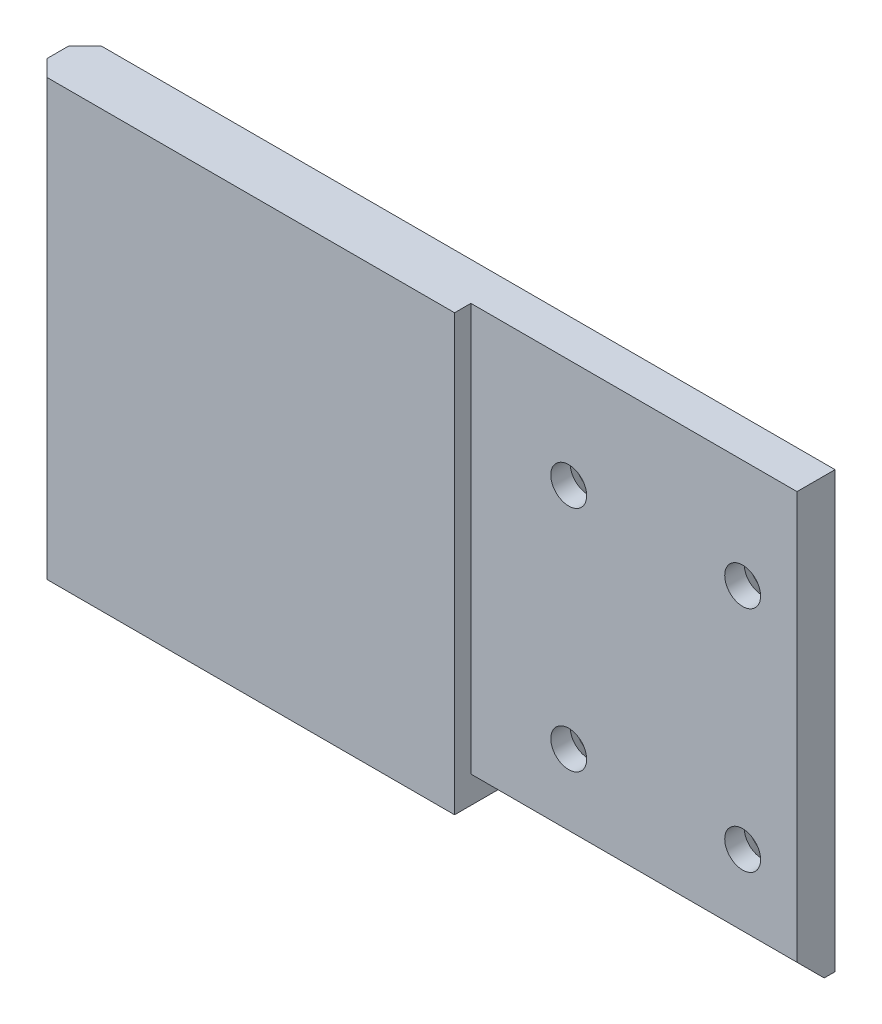
ISO-10303-21;
HEADER;
FILE_DESCRIPTION(('STEP AP214'),'2;1');
FILE_NAME('part.step','',(''),(''),'','','');
FILE_SCHEMA(('AUTOMOTIVE_DESIGN { 1 0 10303 214 1 1 1 1 }'));
ENDSEC;
DATA;
#1=APPLICATION_CONTEXT('core data for automotive mechanical design processes');
#2=APPLICATION_PROTOCOL_DEFINITION('international standard','automotive_design',2000,#1);
#3=PRODUCT_CONTEXT('',#1,'mechanical');
#4=PRODUCT('Part','Part','',(#3));
#5=PRODUCT_RELATED_PRODUCT_CATEGORY('part','',(#4));
#6=PRODUCT_DEFINITION_FORMATION('','',#4);
#7=PRODUCT_DEFINITION_CONTEXT('part definition',#1,'design');
#8=PRODUCT_DEFINITION('design','',#6,#7);
#9=PRODUCT_DEFINITION_SHAPE('','',#8);
#10=(LENGTH_UNIT() NAMED_UNIT(*) SI_UNIT(.MILLI.,.METRE.));
#11=(NAMED_UNIT(*) PLANE_ANGLE_UNIT() SI_UNIT($,.RADIAN.));
#12=(NAMED_UNIT(*) SI_UNIT($,.STERADIAN.) SOLID_ANGLE_UNIT());
#13=UNCERTAINTY_MEASURE_WITH_UNIT(LENGTH_MEASURE(1.E-05),#10,'distance_accuracy_value','');
#14=(GEOMETRIC_REPRESENTATION_CONTEXT(3) GLOBAL_UNCERTAINTY_ASSIGNED_CONTEXT((#13)) GLOBAL_UNIT_ASSIGNED_CONTEXT((#10,
#11,#12)) REPRESENTATION_CONTEXT('',''));
#15=CARTESIAN_POINT('',(0.,0.,0.));
#16=DIRECTION('',(0.,0.,1.));
#17=DIRECTION('',(1.,0.,0.));
#18=AXIS2_PLACEMENT_3D('',#15,#16,#17);
#19=CARTESIAN_POINT('',(0.,0.,10.));
#20=DIRECTION('',(-1.,0.,0.));
#21=DIRECTION('',(0.,0.,1.));
#22=AXIS2_PLACEMENT_3D('',#19,#20,#21);
#23=PLANE('',#22);
#24=DIRECTION('',(0.,1.,0.));
#25=VECTOR('',#24,1.);
#26=CARTESIAN_POINT('',(0.,0.,7.));
#27=LINE('',#26,#25);
#28=CARTESIAN_POINT('',(0.,4.99999999999999,7.));
#29=VERTEX_POINT('',#28);
#30=CARTESIAN_POINT('',(0.,80.,7.));
#31=VERTEX_POINT('',#30);
#32=EDGE_CURVE('E116',#29,#31,#27,.T.);
#33=ORIENTED_EDGE('',*,*,#32,.F.);
#34=DIRECTION('',(0.,-0.707106781186547,-0.707106781186548));
#35=VECTOR('',#34,1.);
#36=CARTESIAN_POINT('',(0.,4.99999999999999,7.));
#37=LINE('',#36,#35);
#38=CARTESIAN_POINT('',(0.,0.,2.));
#39=VERTEX_POINT('',#38);
#40=EDGE_CURVE('E144',#29,#39,#37,.T.);
#41=ORIENTED_EDGE('',*,*,#40,.T.);
#42=DIRECTION('',(0.,0.,-1.));
#43=VECTOR('',#42,1.);
#44=CARTESIAN_POINT('',(0.,0.,10.));
#45=LINE('',#44,#43);
#46=CARTESIAN_POINT('',(0.,0.,0.));
#47=VERTEX_POINT('',#46);
#48=EDGE_CURVE('E225',#39,#47,#45,.T.);
#49=ORIENTED_EDGE('',*,*,#48,.T.);
#50=DIRECTION('',(0.,1.,0.));
#51=VECTOR('',#50,1.);
#52=CARTESIAN_POINT('',(0.,0.,0.));
#53=LINE('',#52,#51);
#54=CARTESIAN_POINT('',(0.,80.,0.));
#55=VERTEX_POINT('',#54);
#56=EDGE_CURVE('E138',#47,#55,#53,.T.);
#57=ORIENTED_EDGE('',*,*,#56,.T.);
#58=DIRECTION('',(0.,0.,-1.));
#59=VECTOR('',#58,1.);
#60=CARTESIAN_POINT('',(0.,80.,10.));
#61=LINE('',#60,#59);
#62=EDGE_CURVE('E130',#31,#55,#61,.T.);
#63=ORIENTED_EDGE('',*,*,#62,.F.);
#64=EDGE_LOOP('',(#33,#41,#49,#57,#63));
#65=FACE_BOUND('',#64,.T.);
#66=ADVANCED_FACE('F39',(#65),#23,.F.);
#67=CARTESIAN_POINT('',(0.,80.,10.));
#68=DIRECTION('',(0.,-1.,0.));
#69=DIRECTION('',(1.,0.,0.));
#70=AXIS2_PLACEMENT_3D('',#67,#68,#69);
#71=PLANE('',#70);
#72=DIRECTION('',(-1.,0.,0.));
#73=VECTOR('',#72,1.);
#74=CARTESIAN_POINT('',(0.,80.,0.));
#75=LINE('',#74,#73);
#76=CARTESIAN_POINT('',(-135.,80.,0.));
#77=VERTEX_POINT('',#76);
#78=EDGE_CURVE('E201',#55,#77,#75,.T.);
#79=ORIENTED_EDGE('',*,*,#78,.T.);
#80=DIRECTION('',(0.707106781186548,0.,-0.707106781186548));
#81=VECTOR('',#80,1.);
#82=CARTESIAN_POINT('',(-138.,80.,3.00000000000001));
#83=LINE('',#82,#81);
#84=CARTESIAN_POINT('',(-138.,80.,3.));
#85=VERTEX_POINT('',#84);
#86=EDGE_CURVE('E48',#77,#85,#83,.F.);
#87=ORIENTED_EDGE('',*,*,#86,.T.);
#88=DIRECTION('',(0.,0.,-1.));
#89=VECTOR('',#88,1.);
#90=CARTESIAN_POINT('',(-138.,80.,10.));
#91=LINE('',#90,#89);
#92=CARTESIAN_POINT('',(-138.,80.,7.00000000000001));
#93=VERTEX_POINT('',#92);
#94=EDGE_CURVE('E140',#93,#85,#91,.T.);
#95=ORIENTED_EDGE('',*,*,#94,.F.);
#96=DIRECTION('',(0.707106781186549,0.,0.707106781186546));
#97=VECTOR('',#96,1.);
#98=CARTESIAN_POINT('',(-135.,80.,10.));
#99=LINE('',#98,#97);
#100=CARTESIAN_POINT('',(-135.,80.,10.));
#101=VERTEX_POINT('',#100);
#102=EDGE_CURVE('E55',#93,#101,#99,.T.);
#103=ORIENTED_EDGE('',*,*,#102,.T.);
#104=DIRECTION('',(-1.,0.,0.));
#105=VECTOR('',#104,1.);
#106=CARTESIAN_POINT('',(0.,80.,10.));
#107=LINE('',#106,#105);
#108=CARTESIAN_POINT('',(-60.,80.,10.));
#109=VERTEX_POINT('',#108);
#110=EDGE_CURVE('E216',#109,#101,#107,.T.);
#111=ORIENTED_EDGE('',*,*,#110,.F.);
#112=DIRECTION('',(0.,0.,1.));
#113=VECTOR('',#112,1.);
#114=CARTESIAN_POINT('',(-60.,80.,7.));
#115=LINE('',#114,#113);
#116=CARTESIAN_POINT('',(-60.,80.,7.));
#117=VERTEX_POINT('',#116);
#118=EDGE_CURVE('E131',#117,#109,#115,.T.);
#119=ORIENTED_EDGE('',*,*,#118,.F.);
#120=DIRECTION('',(-1.,0.,0.));
#121=VECTOR('',#120,1.);
#122=CARTESIAN_POINT('',(0.,80.,7.));
#123=LINE('',#122,#121);
#124=EDGE_CURVE('E120',#31,#117,#123,.T.);
#125=ORIENTED_EDGE('',*,*,#124,.F.);
#126=ORIENTED_EDGE('',*,*,#62,.T.);
#127=EDGE_LOOP('',(#79,#87,#95,#103,#111,#119,#125,#126));
#128=FACE_BOUND('',#127,.T.);
#129=ADVANCED_FACE('F129',(#128),#71,.F.);
#130=CARTESIAN_POINT('',(-138.,0.,10.));
#131=DIRECTION('',(1.,0.,0.));
#132=DIRECTION('',(0.,0.,-1.));
#133=AXIS2_PLACEMENT_3D('',#130,#131,#132);
#134=PLANE('',#133);
#135=ORIENTED_EDGE('',*,*,#94,.T.);
#136=DIRECTION('',(0.,-1.,0.));
#137=VECTOR('',#136,1.);
#138=CARTESIAN_POINT('',(-138.,0.,3.));
#139=LINE('',#138,#137);
#140=CARTESIAN_POINT('',(-138.,0.,3.));
#141=VERTEX_POINT('',#140);
#142=EDGE_CURVE('E186',#85,#141,#139,.T.);
#143=ORIENTED_EDGE('',*,*,#142,.T.);
#144=DIRECTION('',(0.,0.,-1.));
#145=VECTOR('',#144,1.);
#146=CARTESIAN_POINT('',(-138.,0.,10.));
#147=LINE('',#146,#145);
#148=CARTESIAN_POINT('',(-138.,0.,7.00000000000001));
#149=VERTEX_POINT('',#148);
#150=EDGE_CURVE('E147',#149,#141,#147,.T.);
#151=ORIENTED_EDGE('',*,*,#150,.F.);
#152=DIRECTION('',(0.,1.,0.));
#153=VECTOR('',#152,1.);
#154=CARTESIAN_POINT('',(-138.,80.,7.00000000000001));
#155=LINE('',#154,#153);
#156=EDGE_CURVE('E183',#149,#93,#155,.T.);
#157=ORIENTED_EDGE('',*,*,#156,.T.);
#158=EDGE_LOOP('',(#135,#143,#151,#157));
#159=FACE_BOUND('',#158,.T.);
#160=ADVANCED_FACE('F205',(#159),#134,.F.);
#161=CARTESIAN_POINT('',(0.,0.,10.));
#162=DIRECTION('',(0.,1.,0.));
#163=DIRECTION('',(0.,0.,1.));
#164=AXIS2_PLACEMENT_3D('',#161,#162,#163);
#165=PLANE('',#164);
#166=ORIENTED_EDGE('',*,*,#150,.T.);
#167=DIRECTION('',(-0.707106781186548,0.,0.707106781186548));
#168=VECTOR('',#167,1.);
#169=CARTESIAN_POINT('',(-138.,0.,3.));
#170=LINE('',#169,#168);
#171=CARTESIAN_POINT('',(-135.,0.,0.));
#172=VERTEX_POINT('',#171);
#173=EDGE_CURVE('E193',#141,#172,#170,.F.);
#174=ORIENTED_EDGE('',*,*,#173,.T.);
#175=DIRECTION('',(1.,0.,0.));
#176=VECTOR('',#175,1.);
#177=CARTESIAN_POINT('',(0.,0.,0.));
#178=LINE('',#177,#176);
#179=EDGE_CURVE('E213',#172,#47,#178,.T.);
#180=ORIENTED_EDGE('',*,*,#179,.T.);
#181=ORIENTED_EDGE('',*,*,#48,.F.);
#182=DIRECTION('',(-1.,0.,0.));
#183=VECTOR('',#182,1.);
#184=CARTESIAN_POINT('',(-60.,0.,2.));
#185=LINE('',#184,#183);
#186=CARTESIAN_POINT('',(-60.,0.,2.));
#187=VERTEX_POINT('',#186);
#188=EDGE_CURVE('E176',#39,#187,#185,.T.);
#189=ORIENTED_EDGE('',*,*,#188,.T.);
#190=DIRECTION('',(0.,0.,1.));
#191=VECTOR('',#190,1.);
#192=CARTESIAN_POINT('',(-60.,0.,7.));
#193=LINE('',#192,#191);
#194=CARTESIAN_POINT('',(-60.,0.,10.));
#195=VERTEX_POINT('',#194);
#196=EDGE_CURVE('E236',#187,#195,#193,.T.);
#197=ORIENTED_EDGE('',*,*,#196,.T.);
#198=DIRECTION('',(1.,0.,0.));
#199=VECTOR('',#198,1.);
#200=CARTESIAN_POINT('',(0.,0.,10.));
#201=LINE('',#200,#199);
#202=CARTESIAN_POINT('',(-135.,0.,10.));
#203=VERTEX_POINT('',#202);
#204=EDGE_CURVE('E220',#203,#195,#201,.T.);
#205=ORIENTED_EDGE('',*,*,#204,.F.);
#206=DIRECTION('',(-0.707106781186549,0.,-0.707106781186546));
#207=VECTOR('',#206,1.);
#208=CARTESIAN_POINT('',(-135.,0.,10.));
#209=LINE('',#208,#207);
#210=EDGE_CURVE('E190',#203,#149,#209,.T.);
#211=ORIENTED_EDGE('',*,*,#210,.T.);
#212=EDGE_LOOP('',(#166,#174,#180,#181,#189,#197,#205,#211));
#213=FACE_BOUND('',#212,.T.);
#214=ADVANCED_FACE('F211',(#213),#165,.F.);
#215=CARTESIAN_POINT('',(0.,0.,10.));
#216=DIRECTION('',(0.,0.,1.));
#217=DIRECTION('',(1.,0.,0.));
#218=AXIS2_PLACEMENT_3D('',#215,#216,#217);
#219=PLANE('',#218);
#220=ORIENTED_EDGE('',*,*,#110,.T.);
#221=DIRECTION('',(0.,-1.,0.));
#222=VECTOR('',#221,1.);
#223=CARTESIAN_POINT('',(-135.,0.,10.));
#224=LINE('',#223,#222);
#225=EDGE_CURVE('E11',#101,#203,#224,.T.);
#226=ORIENTED_EDGE('',*,*,#225,.T.);
#227=ORIENTED_EDGE('',*,*,#204,.T.);
#228=DIRECTION('',(0.,-1.,0.));
#229=VECTOR('',#228,1.);
#230=CARTESIAN_POINT('',(-60.,0.,10.));
#231=LINE('',#230,#229);
#232=EDGE_CURVE('E127',#109,#195,#231,.T.);
#233=ORIENTED_EDGE('',*,*,#232,.F.);
#234=EDGE_LOOP('',(#220,#226,#227,#233));
#235=FACE_BOUND('',#234,.T.);
#236=ADVANCED_FACE('F277',(#235),#219,.T.);
#237=CARTESIAN_POINT('',(0.,0.,0.));
#238=DIRECTION('',(0.,0.,1.));
#239=DIRECTION('',(1.,0.,0.));
#240=AXIS2_PLACEMENT_3D('',#237,#238,#239);
#241=PLANE('',#240);
#242=CARTESIAN_POINT('',(-9.99999999999999,60.,0.));
#243=DIRECTION('',(0.,0.,-1.));
#244=DIRECTION('',(-1.,0.,0.));
#245=AXIS2_PLACEMENT_3D('',#242,#243,#244);
#246=CIRCLE('',#245,6.72);
#247=CARTESIAN_POINT('',(-16.72,60.,0.));
#248=VERTEX_POINT('',#247);
#249=EDGE_CURVE('E267',#248,#248,#246,.T.);
#250=ORIENTED_EDGE('',*,*,#249,.F.);
#251=EDGE_LOOP('',(#250));
#252=FACE_BOUND('',#251,.T.);
#253=CARTESIAN_POINT('',(-42.,60.,0.));
#254=DIRECTION('',(0.,0.,-1.));
#255=DIRECTION('',(-1.,0.,0.));
#256=AXIS2_PLACEMENT_3D('',#253,#254,#255);
#257=CIRCLE('',#256,6.72);
#258=CARTESIAN_POINT('',(-48.72,60.,0.));
#259=VERTEX_POINT('',#258);
#260=EDGE_CURVE('E171',#259,#259,#257,.T.);
#261=ORIENTED_EDGE('',*,*,#260,.F.);
#262=EDGE_LOOP('',(#261));
#263=FACE_BOUND('',#262,.T.);
#264=CARTESIAN_POINT('',(-42.,18.,0.));
#265=DIRECTION('',(0.,0.,-1.));
#266=DIRECTION('',(-1.,0.,0.));
#267=AXIS2_PLACEMENT_3D('',#264,#265,#266);
#268=CIRCLE('',#267,6.72);
#269=CARTESIAN_POINT('',(-48.72,18.,0.));
#270=VERTEX_POINT('',#269);
#271=EDGE_CURVE('E166',#270,#270,#268,.T.);
#272=ORIENTED_EDGE('',*,*,#271,.F.);
#273=EDGE_LOOP('',(#272));
#274=FACE_BOUND('',#273,.T.);
#275=CARTESIAN_POINT('',(-10.,18.,0.));
#276=DIRECTION('',(0.,0.,-1.));
#277=DIRECTION('',(-1.,0.,0.));
#278=AXIS2_PLACEMENT_3D('',#275,#276,#277);
#279=CIRCLE('',#278,6.72);
#280=CARTESIAN_POINT('',(-16.72,18.,0.));
#281=VERTEX_POINT('',#280);
#282=EDGE_CURVE('E160',#281,#281,#279,.T.);
#283=ORIENTED_EDGE('',*,*,#282,.F.);
#284=EDGE_LOOP('',(#283));
#285=FACE_BOUND('',#284,.T.);
#286=ORIENTED_EDGE('',*,*,#179,.F.);
#287=DIRECTION('',(0.,1.,0.));
#288=VECTOR('',#287,1.);
#289=CARTESIAN_POINT('',(-135.,0.,0.));
#290=LINE('',#289,#288);
#291=EDGE_CURVE('E63',#172,#77,#290,.T.);
#292=ORIENTED_EDGE('',*,*,#291,.T.);
#293=ORIENTED_EDGE('',*,*,#78,.F.);
#294=ORIENTED_EDGE('',*,*,#56,.F.);
#295=EDGE_LOOP('',(#286,#292,#293,#294));
#296=FACE_BOUND('',#295,.T.);
#297=ADVANCED_FACE('F214',(#252,#263,#274,#285,#296),#241,.F.);
#298=CARTESIAN_POINT('',(-60.,0.,7.));
#299=DIRECTION('',(-1.,0.,0.));
#300=DIRECTION('',(0.,0.,1.));
#301=AXIS2_PLACEMENT_3D('',#298,#299,#300);
#302=PLANE('',#301);
#303=ORIENTED_EDGE('',*,*,#232,.T.);
#304=ORIENTED_EDGE('',*,*,#196,.F.);
#305=DIRECTION('',(0.,0.707106781186547,0.707106781186548));
#306=VECTOR('',#305,1.);
#307=CARTESIAN_POINT('',(-60.,2.5,4.5));
#308=LINE('',#307,#306);
#309=CARTESIAN_POINT('',(-60.,4.99999999999999,7.));
#310=VERTEX_POINT('',#309);
#311=EDGE_CURVE('E180',#187,#310,#308,.T.);
#312=ORIENTED_EDGE('',*,*,#311,.T.);
#313=DIRECTION('',(0.,-1.,0.));
#314=VECTOR('',#313,1.);
#315=CARTESIAN_POINT('',(-60.,0.,7.));
#316=LINE('',#315,#314);
#317=EDGE_CURVE('E133',#117,#310,#316,.T.);
#318=ORIENTED_EDGE('',*,*,#317,.F.);
#319=ORIENTED_EDGE('',*,*,#118,.T.);
#320=EDGE_LOOP('',(#303,#304,#312,#318,#319));
#321=FACE_BOUND('',#320,.T.);
#322=ADVANCED_FACE('F276',(#321),#302,.F.);
#323=CARTESIAN_POINT('',(0.,0.,7.));
#324=DIRECTION('',(0.,0.,1.));
#325=DIRECTION('',(1.,0.,0.));
#326=AXIS2_PLACEMENT_3D('',#323,#324,#325);
#327=PLANE('',#326);
#328=CARTESIAN_POINT('',(-9.99999999999999,60.,7.));
#329=DIRECTION('',(0.,0.,1.));
#330=DIRECTION('',(1.,0.,0.));
#331=AXIS2_PLACEMENT_3D('',#328,#329,#330);
#332=CIRCLE('',#331,3.29999999999999);
#333=CARTESIAN_POINT('',(-6.7,60.,7.));
#334=VERTEX_POINT('',#333);
#335=EDGE_CURVE('E168',#334,#334,#332,.T.);
#336=ORIENTED_EDGE('',*,*,#335,.F.);
#337=EDGE_LOOP('',(#336));
#338=FACE_BOUND('',#337,.T.);
#339=CARTESIAN_POINT('',(-42.,60.,7.));
#340=DIRECTION('',(0.,0.,1.));
#341=DIRECTION('',(1.,0.,0.));
#342=AXIS2_PLACEMENT_3D('',#339,#340,#341);
#343=CIRCLE('',#342,3.29999999999999);
#344=CARTESIAN_POINT('',(-38.7,60.,7.));
#345=VERTEX_POINT('',#344);
#346=EDGE_CURVE('E162',#345,#345,#343,.T.);
#347=ORIENTED_EDGE('',*,*,#346,.F.);
#348=EDGE_LOOP('',(#347));
#349=FACE_BOUND('',#348,.T.);
#350=CARTESIAN_POINT('',(-42.,18.,7.));
#351=DIRECTION('',(0.,0.,1.));
#352=DIRECTION('',(1.,0.,0.));
#353=AXIS2_PLACEMENT_3D('',#350,#351,#352);
#354=CIRCLE('',#353,3.29999999999999);
#355=CARTESIAN_POINT('',(-38.7,18.,7.));
#356=VERTEX_POINT('',#355);
#357=EDGE_CURVE('E156',#356,#356,#354,.T.);
#358=ORIENTED_EDGE('',*,*,#357,.F.);
#359=EDGE_LOOP('',(#358));
#360=FACE_BOUND('',#359,.T.);
#361=CARTESIAN_POINT('',(-10.,18.,7.));
#362=DIRECTION('',(0.,0.,1.));
#363=DIRECTION('',(1.,0.,0.));
#364=AXIS2_PLACEMENT_3D('',#361,#362,#363);
#365=CIRCLE('',#364,3.29999999999999);
#366=CARTESIAN_POINT('',(-6.70000000000001,18.,7.));
#367=VERTEX_POINT('',#366);
#368=EDGE_CURVE('E151',#367,#367,#365,.T.);
#369=ORIENTED_EDGE('',*,*,#368,.F.);
#370=EDGE_LOOP('',(#369));
#371=FACE_BOUND('',#370,.T.);
#372=ORIENTED_EDGE('',*,*,#317,.T.);
#373=DIRECTION('',(1.,0.,0.));
#374=VECTOR('',#373,1.);
#375=CARTESIAN_POINT('',(0.,4.99999999999999,7.));
#376=LINE('',#375,#374);
#377=EDGE_CURVE('E123',#310,#29,#376,.T.);
#378=ORIENTED_EDGE('',*,*,#377,.T.);
#379=ORIENTED_EDGE('',*,*,#32,.T.);
#380=ORIENTED_EDGE('',*,*,#124,.T.);
#381=EDGE_LOOP('',(#372,#378,#379,#380));
#382=FACE_BOUND('',#381,.T.);
#383=ADVANCED_FACE('F119',(#338,#349,#360,#371,#382),#327,.T.);
#384=CARTESIAN_POINT('',(-10.,18.,0.));
#385=DIRECTION('',(0.,0.,-1.));
#386=DIRECTION('',(-1.,0.,0.));
#387=AXIS2_PLACEMENT_3D('',#384,#385,#386);
#388=CYLINDRICAL_SURFACE('',#387,3.29999999999999);
#389=ORIENTED_EDGE('',*,*,#368,.T.);
#390=EDGE_LOOP('',(#389));
#391=FACE_BOUND('',#390,.T.);
#392=CARTESIAN_POINT('',(-10.,18.,3.42000000000002));
#393=DIRECTION('',(0.,0.,-1.));
#394=DIRECTION('',(-1.,0.,0.));
#395=AXIS2_PLACEMENT_3D('',#392,#393,#394);
#396=CIRCLE('',#395,3.29999999999999);
#397=CARTESIAN_POINT('',(-13.3,18.,3.42000000000002));
#398=VERTEX_POINT('',#397);
#399=EDGE_CURVE('E155',#398,#398,#396,.T.);
#400=ORIENTED_EDGE('',*,*,#399,.T.);
#401=EDGE_LOOP('',(#400));
#402=FACE_BOUND('',#401,.T.);
#403=ADVANCED_FACE('F288',(#391,#402),#388,.F.);
#404=CARTESIAN_POINT('',(-10.,18.,0.));
#405=DIRECTION('',(0.,0.,-1.));
#406=DIRECTION('',(-1.,0.,0.));
#407=AXIS2_PLACEMENT_3D('',#404,#405,#406);
#408=CONICAL_SURFACE('',#407,6.72,0.785398163397447);
#409=ORIENTED_EDGE('',*,*,#399,.F.);
#410=EDGE_LOOP('',(#409));
#411=FACE_BOUND('',#410,.T.);
#412=ORIENTED_EDGE('',*,*,#282,.T.);
#413=EDGE_LOOP('',(#412));
#414=FACE_BOUND('',#413,.T.);
#415=ADVANCED_FACE('F285',(#411,#414),#408,.F.);
#416=CARTESIAN_POINT('',(-42.,18.,0.));
#417=DIRECTION('',(0.,0.,-1.));
#418=DIRECTION('',(-1.,0.,0.));
#419=AXIS2_PLACEMENT_3D('',#416,#417,#418);
#420=CYLINDRICAL_SURFACE('',#419,3.29999999999999);
#421=ORIENTED_EDGE('',*,*,#357,.T.);
#422=EDGE_LOOP('',(#421));
#423=FACE_BOUND('',#422,.T.);
#424=CARTESIAN_POINT('',(-42.,18.,3.42000000000002));
#425=DIRECTION('',(0.,0.,-1.));
#426=DIRECTION('',(-1.,0.,0.));
#427=AXIS2_PLACEMENT_3D('',#424,#425,#426);
#428=CIRCLE('',#427,3.29999999999999);
#429=CARTESIAN_POINT('',(-45.3,18.,3.42000000000002));
#430=VERTEX_POINT('',#429);
#431=EDGE_CURVE('E161',#430,#430,#428,.T.);
#432=ORIENTED_EDGE('',*,*,#431,.T.);
#433=EDGE_LOOP('',(#432));
#434=FACE_BOUND('',#433,.T.);
#435=ADVANCED_FACE('F287',(#423,#434),#420,.F.);
#436=CARTESIAN_POINT('',(-42.,18.,0.));
#437=DIRECTION('',(0.,0.,-1.));
#438=DIRECTION('',(-1.,0.,0.));
#439=AXIS2_PLACEMENT_3D('',#436,#437,#438);
#440=CONICAL_SURFACE('',#439,6.72,0.785398163397446);
#441=ORIENTED_EDGE('',*,*,#431,.F.);
#442=EDGE_LOOP('',(#441));
#443=FACE_BOUND('',#442,.T.);
#444=ORIENTED_EDGE('',*,*,#271,.T.);
#445=EDGE_LOOP('',(#444));
#446=FACE_BOUND('',#445,.T.);
#447=ADVANCED_FACE('F295',(#443,#446),#440,.F.);
#448=CARTESIAN_POINT('',(-42.,60.,0.));
#449=DIRECTION('',(0.,0.,-1.));
#450=DIRECTION('',(-1.,0.,0.));
#451=AXIS2_PLACEMENT_3D('',#448,#449,#450);
#452=CYLINDRICAL_SURFACE('',#451,3.29999999999999);
#453=ORIENTED_EDGE('',*,*,#346,.T.);
#454=EDGE_LOOP('',(#453));
#455=FACE_BOUND('',#454,.T.);
#456=CARTESIAN_POINT('',(-42.,60.,3.42000000000002));
#457=DIRECTION('',(0.,0.,-1.));
#458=DIRECTION('',(-1.,0.,0.));
#459=AXIS2_PLACEMENT_3D('',#456,#457,#458);
#460=CIRCLE('',#459,3.29999999999999);
#461=CARTESIAN_POINT('',(-45.3,60.,3.42000000000002));
#462=VERTEX_POINT('',#461);
#463=EDGE_CURVE('E167',#462,#462,#460,.T.);
#464=ORIENTED_EDGE('',*,*,#463,.T.);
#465=EDGE_LOOP('',(#464));
#466=FACE_BOUND('',#465,.T.);
#467=ADVANCED_FACE('F394',(#455,#466),#452,.F.);
#468=CARTESIAN_POINT('',(-42.,60.,0.));
#469=DIRECTION('',(0.,0.,-1.));
#470=DIRECTION('',(-1.,0.,0.));
#471=AXIS2_PLACEMENT_3D('',#468,#469,#470);
#472=CONICAL_SURFACE('',#471,6.72,0.785398163397446);
#473=ORIENTED_EDGE('',*,*,#463,.F.);
#474=EDGE_LOOP('',(#473));
#475=FACE_BOUND('',#474,.T.);
#476=ORIENTED_EDGE('',*,*,#260,.T.);
#477=EDGE_LOOP('',(#476));
#478=FACE_BOUND('',#477,.T.);
#479=ADVANCED_FACE('F385',(#475,#478),#472,.F.);
#480=CARTESIAN_POINT('',(-9.99999999999999,60.,0.));
#481=DIRECTION('',(0.,0.,-1.));
#482=DIRECTION('',(-1.,0.,0.));
#483=AXIS2_PLACEMENT_3D('',#480,#481,#482);
#484=CYLINDRICAL_SURFACE('',#483,3.29999999999999);
#485=ORIENTED_EDGE('',*,*,#335,.T.);
#486=EDGE_LOOP('',(#485));
#487=FACE_BOUND('',#486,.T.);
#488=CARTESIAN_POINT('',(-9.99999999999999,60.,3.42000000000002));
#489=DIRECTION('',(0.,0.,-1.));
#490=DIRECTION('',(-1.,0.,0.));
#491=AXIS2_PLACEMENT_3D('',#488,#489,#490);
#492=CIRCLE('',#491,3.29999999999999);
#493=CARTESIAN_POINT('',(-13.3,60.,3.42000000000002));
#494=VERTEX_POINT('',#493);
#495=EDGE_CURVE('E172',#494,#494,#492,.T.);
#496=ORIENTED_EDGE('',*,*,#495,.T.);
#497=EDGE_LOOP('',(#496));
#498=FACE_BOUND('',#497,.T.);
#499=ADVANCED_FACE('F376',(#487,#498),#484,.F.);
#500=CARTESIAN_POINT('',(-9.99999999999999,60.,0.));
#501=DIRECTION('',(0.,0.,-1.));
#502=DIRECTION('',(-1.,0.,0.));
#503=AXIS2_PLACEMENT_3D('',#500,#501,#502);
#504=CONICAL_SURFACE('',#503,6.72,0.785398163397447);
#505=ORIENTED_EDGE('',*,*,#495,.F.);
#506=EDGE_LOOP('',(#505));
#507=FACE_BOUND('',#506,.T.);
#508=ORIENTED_EDGE('',*,*,#249,.T.);
#509=EDGE_LOOP('',(#508));
#510=FACE_BOUND('',#509,.T.);
#511=ADVANCED_FACE('F272',(#507,#510),#504,.F.);
#512=CARTESIAN_POINT('',(0.,4.99999999999999,7.));
#513=DIRECTION('',(0.,-0.707106781186548,0.707106781186547));
#514=DIRECTION('',(-1.,0.,0.));
#515=AXIS2_PLACEMENT_3D('',#512,#513,#514);
#516=PLANE('',#515);
#517=ORIENTED_EDGE('',*,*,#311,.F.);
#518=ORIENTED_EDGE('',*,*,#188,.F.);
#519=ORIENTED_EDGE('',*,*,#40,.F.);
#520=ORIENTED_EDGE('',*,*,#377,.F.);
#521=EDGE_LOOP('',(#517,#518,#519,#520));
#522=FACE_BOUND('',#521,.T.);
#523=ADVANCED_FACE('F309',(#522),#516,.T.);
#524=CARTESIAN_POINT('',(-138.,0.,3.));
#525=DIRECTION('',(0.707106781186547,0.,0.707106781186547));
#526=DIRECTION('',(0.,-1.,0.));
#527=AXIS2_PLACEMENT_3D('',#524,#525,#526);
#528=PLANE('',#527);
#529=ORIENTED_EDGE('',*,*,#86,.F.);
#530=ORIENTED_EDGE('',*,*,#291,.F.);
#531=ORIENTED_EDGE('',*,*,#173,.F.);
#532=ORIENTED_EDGE('',*,*,#142,.F.);
#533=EDGE_LOOP('',(#529,#530,#531,#532));
#534=FACE_BOUND('',#533,.T.);
#535=ADVANCED_FACE('F209',(#534),#528,.F.);
#536=CARTESIAN_POINT('',(-135.,0.,10.));
#537=DIRECTION('',(-0.707106781186546,0.,0.707106781186549));
#538=DIRECTION('',(0.,1.,0.));
#539=AXIS2_PLACEMENT_3D('',#536,#537,#538);
#540=PLANE('',#539);
#541=ORIENTED_EDGE('',*,*,#102,.F.);
#542=ORIENTED_EDGE('',*,*,#156,.F.);
#543=ORIENTED_EDGE('',*,*,#210,.F.);
#544=ORIENTED_EDGE('',*,*,#225,.F.);
#545=EDGE_LOOP('',(#541,#542,#543,#544));
#546=FACE_BOUND('',#545,.T.);
#547=ADVANCED_FACE('F41',(#546),#540,.T.);
#548=CLOSED_SHELL('',(#66,#129,#160,#214,#236,#297,#322,#383,#403,#415,#435,#447,#467,#479,#499,
#511,#523,#535,#547));
#549=MANIFOLD_SOLID_BREP('B2',#548);
#550=ADVANCED_BREP_SHAPE_REPRESENTATION('',(#18,#549),#14);
#551=SHAPE_DEFINITION_REPRESENTATION(#9,#550);
ENDSEC;
END-ISO-10303-21;
